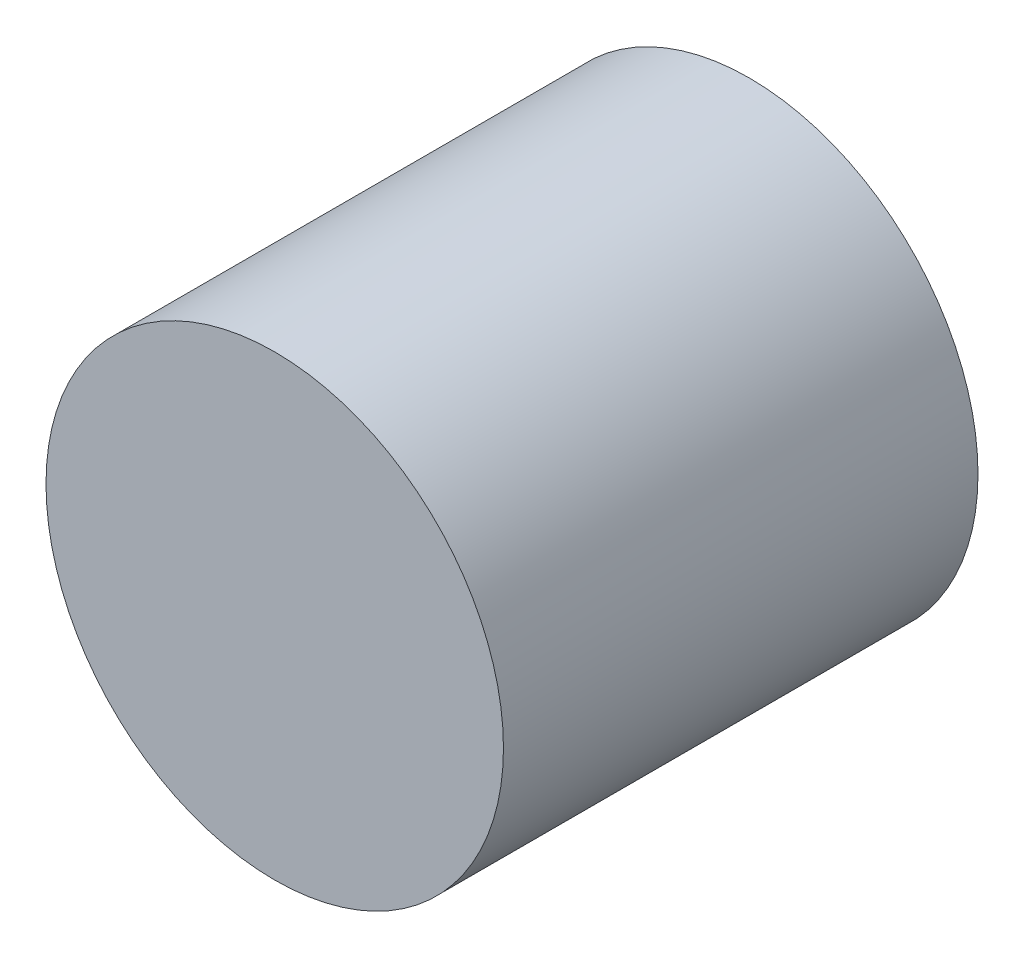
ISO-10303-21;
HEADER;
FILE_DESCRIPTION(('STEP AP214'),'2;1');
FILE_NAME('part.step','',(''),(''),'','','');
FILE_SCHEMA(('AUTOMOTIVE_DESIGN { 1 0 10303 214 1 1 1 1 }'));
ENDSEC;
DATA;
#1=APPLICATION_CONTEXT('core data for automotive mechanical design processes');
#2=APPLICATION_PROTOCOL_DEFINITION('international standard','automotive_design',2000,#1);
#3=PRODUCT_CONTEXT('',#1,'mechanical');
#4=PRODUCT('Part','Part','',(#3));
#5=PRODUCT_RELATED_PRODUCT_CATEGORY('part','',(#4));
#6=PRODUCT_DEFINITION_FORMATION('','',#4);
#7=PRODUCT_DEFINITION_CONTEXT('part definition',#1,'design');
#8=PRODUCT_DEFINITION('design','',#6,#7);
#9=PRODUCT_DEFINITION_SHAPE('','',#8);
#10=(LENGTH_UNIT() NAMED_UNIT(*) SI_UNIT(.MILLI.,.METRE.));
#11=(NAMED_UNIT(*) PLANE_ANGLE_UNIT() SI_UNIT($,.RADIAN.));
#12=(NAMED_UNIT(*) SI_UNIT($,.STERADIAN.) SOLID_ANGLE_UNIT());
#13=UNCERTAINTY_MEASURE_WITH_UNIT(LENGTH_MEASURE(1.E-05),#10,'distance_accuracy_value','');
#14=(GEOMETRIC_REPRESENTATION_CONTEXT(3) GLOBAL_UNCERTAINTY_ASSIGNED_CONTEXT((#13)) GLOBAL_UNIT_ASSIGNED_CONTEXT((#10,
#11,#12)) REPRESENTATION_CONTEXT('',''));
#15=CARTESIAN_POINT('',(0.,0.,0.));
#16=DIRECTION('',(0.,0.,1.));
#17=DIRECTION('',(1.,0.,0.));
#18=AXIS2_PLACEMENT_3D('',#15,#16,#17);
#19=CARTESIAN_POINT('',(0.,0.,50.8));
#20=DIRECTION('',(0.,0.,-1.));
#21=DIRECTION('',(-1.,0.,0.));
#22=AXIS2_PLACEMENT_3D('',#19,#20,#21);
#23=CYLINDRICAL_SURFACE('',#22,24.485925975688);
#24=CARTESIAN_POINT('',(0.,0.,50.8));
#25=DIRECTION('',(0.,0.,1.));
#26=DIRECTION('',(1.,0.,0.));
#27=AXIS2_PLACEMENT_3D('',#24,#25,#26);
#28=CIRCLE('',#27,24.485925975688);
#29=CARTESIAN_POINT('',(24.485925975688,0.,50.8));
#30=VERTEX_POINT('',#29);
#31=EDGE_CURVE('E10',#30,#30,#28,.T.);
#32=ORIENTED_EDGE('',*,*,#31,.F.);
#33=EDGE_LOOP('',(#32));
#34=FACE_BOUND('',#33,.T.);
#35=CARTESIAN_POINT('',(0.,0.,0.));
#36=DIRECTION('',(0.,0.,1.));
#37=DIRECTION('',(1.,0.,0.));
#38=AXIS2_PLACEMENT_3D('',#35,#36,#37);
#39=CIRCLE('',#38,24.485925975688);
#40=CARTESIAN_POINT('',(24.485925975688,0.,0.));
#41=VERTEX_POINT('',#40);
#42=EDGE_CURVE('E34',#41,#41,#39,.T.);
#43=ORIENTED_EDGE('',*,*,#42,.T.);
#44=EDGE_LOOP('',(#43));
#45=FACE_BOUND('',#44,.T.);
#46=ADVANCED_FACE('F31',(#34,#45),#23,.T.);
#47=CARTESIAN_POINT('',(0.,0.,50.8));
#48=DIRECTION('',(0.,0.,1.));
#49=DIRECTION('',(1.,0.,0.));
#50=AXIS2_PLACEMENT_3D('',#47,#48,#49);
#51=PLANE('',#50);
#52=ORIENTED_EDGE('',*,*,#31,.T.);
#53=EDGE_LOOP('',(#52));
#54=FACE_BOUND('',#53,.T.);
#55=ADVANCED_FACE('F46',(#54),#51,.T.);
#56=CARTESIAN_POINT('',(0.,0.,0.));
#57=DIRECTION('',(0.,0.,1.));
#58=DIRECTION('',(1.,0.,0.));
#59=AXIS2_PLACEMENT_3D('',#56,#57,#58);
#60=PLANE('',#59);
#61=ORIENTED_EDGE('',*,*,#42,.F.);
#62=EDGE_LOOP('',(#61));
#63=FACE_BOUND('',#62,.T.);
#64=ADVANCED_FACE('F44',(#63),#60,.F.);
#65=CLOSED_SHELL('',(#46,#55,#64));
#66=MANIFOLD_SOLID_BREP('B2',#65);
#67=ADVANCED_BREP_SHAPE_REPRESENTATION('',(#18,#66),#14);
#68=SHAPE_DEFINITION_REPRESENTATION(#9,#67);
ENDSEC;
END-ISO-10303-21;
